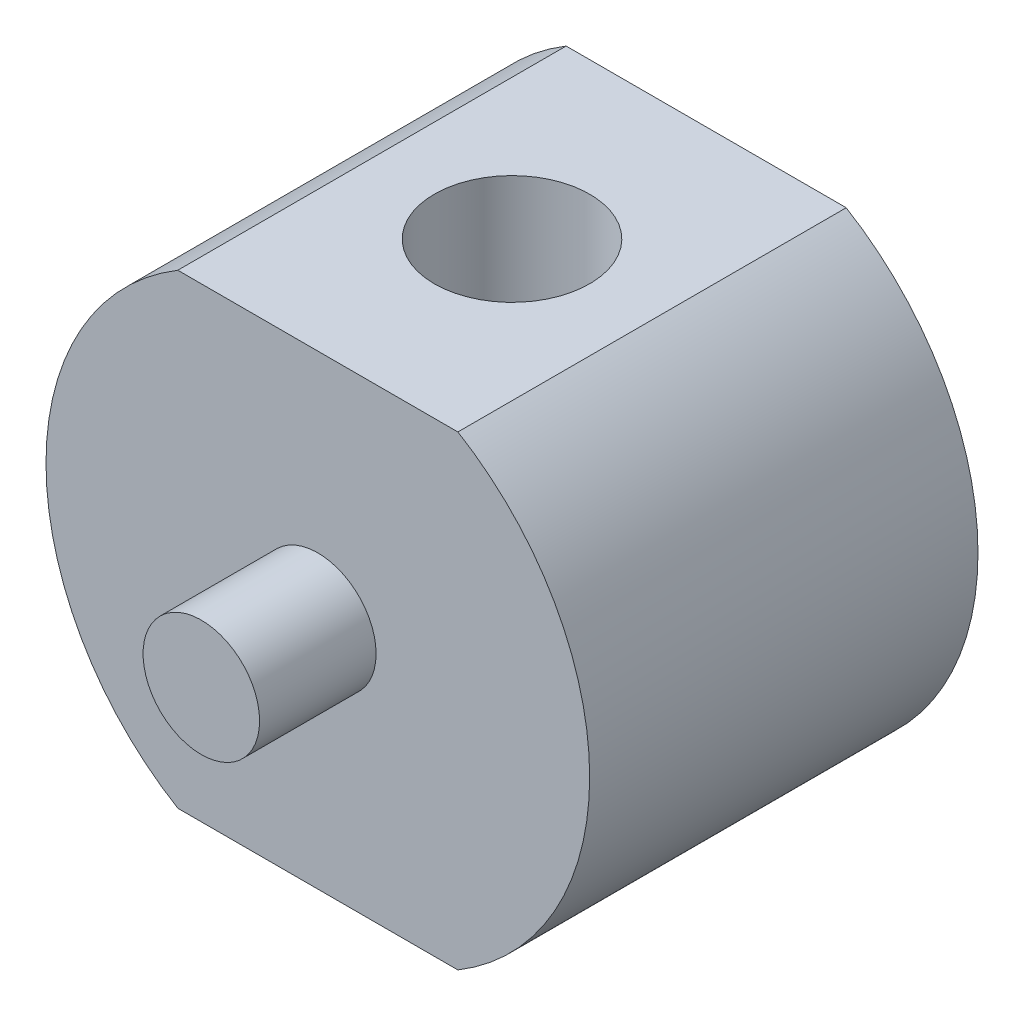
ISO-10303-21;
HEADER;
FILE_DESCRIPTION(('STEP AP214'),'2;1');
FILE_NAME('part.step','',(''),(''),'','','');
FILE_SCHEMA(('AUTOMOTIVE_DESIGN { 1 0 10303 214 1 1 1 1 }'));
ENDSEC;
DATA;
#1=APPLICATION_CONTEXT('core data for automotive mechanical design processes');
#2=APPLICATION_PROTOCOL_DEFINITION('international standard','automotive_design',2000,#1);
#3=PRODUCT_CONTEXT('',#1,'mechanical');
#4=PRODUCT('Part','Part','',(#3));
#5=PRODUCT_RELATED_PRODUCT_CATEGORY('part','',(#4));
#6=PRODUCT_DEFINITION_FORMATION('','',#4);
#7=PRODUCT_DEFINITION_CONTEXT('part definition',#1,'design');
#8=PRODUCT_DEFINITION('design','',#6,#7);
#9=PRODUCT_DEFINITION_SHAPE('','',#8);
#10=(LENGTH_UNIT() NAMED_UNIT(*) SI_UNIT(.MILLI.,.METRE.));
#11=(NAMED_UNIT(*) PLANE_ANGLE_UNIT() SI_UNIT($,.RADIAN.));
#12=(NAMED_UNIT(*) SI_UNIT($,.STERADIAN.) SOLID_ANGLE_UNIT());
#13=UNCERTAINTY_MEASURE_WITH_UNIT(LENGTH_MEASURE(1.E-05),#10,'distance_accuracy_value','');
#14=(GEOMETRIC_REPRESENTATION_CONTEXT(3) GLOBAL_UNCERTAINTY_ASSIGNED_CONTEXT((#13)) GLOBAL_UNIT_ASSIGNED_CONTEXT((#10,
#11,#12)) REPRESENTATION_CONTEXT('',''));
#15=CARTESIAN_POINT('',(0.,0.,0.));
#16=DIRECTION('',(0.,0.,1.));
#17=DIRECTION('',(1.,0.,0.));
#18=AXIS2_PLACEMENT_3D('',#15,#16,#17);
#19=CARTESIAN_POINT('',(-3.60647702767034,5.99944359494163,10.));
#20=DIRECTION('',(0.,1.,0.));
#21=DIRECTION('',(0.,0.,1.));
#22=AXIS2_PLACEMENT_3D('',#19,#20,#21);
#23=PLANE('',#22);
#24=DIRECTION('',(1.,0.,0.));
#25=VECTOR('',#24,1.);
#26=CARTESIAN_POINT('',(-3.60647702767034,5.99944359494163,10.));
#27=LINE('',#26,#25);
#28=CARTESIAN_POINT('',(-3.60647702767034,5.99944359494163,10.));
#29=VERTEX_POINT('',#28);
#30=CARTESIAN_POINT('',(3.60647702767034,5.99944359494163,10.));
#31=VERTEX_POINT('',#30);
#32=EDGE_CURVE('E105',#29,#31,#27,.T.);
#33=ORIENTED_EDGE('',*,*,#32,.T.);
#34=DIRECTION('',(0.,0.,-1.));
#35=VECTOR('',#34,1.);
#36=CARTESIAN_POINT('',(3.60647702767034,5.99944359494163,10.));
#37=LINE('',#36,#35);
#38=CARTESIAN_POINT('',(3.60647702767034,5.99944359494163,0.));
#39=VERTEX_POINT('',#38);
#40=EDGE_CURVE('E55',#31,#39,#37,.T.);
#41=ORIENTED_EDGE('',*,*,#40,.T.);
#42=DIRECTION('',(1.,0.,0.));
#43=VECTOR('',#42,1.);
#44=CARTESIAN_POINT('',(-3.60647702767034,5.99944359494163,0.));
#45=LINE('',#44,#43);
#46=CARTESIAN_POINT('',(-3.60647702767034,5.99944359494163,0.));
#47=VERTEX_POINT('',#46);
#48=EDGE_CURVE('E96',#47,#39,#45,.T.);
#49=ORIENTED_EDGE('',*,*,#48,.F.);
#50=DIRECTION('',(0.,0.,-1.));
#51=VECTOR('',#50,1.);
#52=CARTESIAN_POINT('',(-3.60647702767034,5.99944359494163,10.));
#53=LINE('',#52,#51);
#54=EDGE_CURVE('E47',#29,#47,#53,.T.);
#55=ORIENTED_EDGE('',*,*,#54,.F.);
#56=EDGE_LOOP('',(#33,#41,#49,#55));
#57=FACE_BOUND('',#56,.T.);
#58=CARTESIAN_POINT('',(0.,5.99944359494163,5.));
#59=DIRECTION('',(0.,1.,0.));
#60=DIRECTION('',(0.,0.,1.));
#61=AXIS2_PLACEMENT_3D('',#58,#59,#60);
#62=CIRCLE('',#61,2.);
#63=CARTESIAN_POINT('',(0.,5.99944359494163,7.));
#64=VERTEX_POINT('',#63);
#65=EDGE_CURVE('E116',#64,#64,#62,.T.);
#66=ORIENTED_EDGE('',*,*,#65,.F.);
#67=EDGE_LOOP('',(#66));
#68=FACE_BOUND('',#67,.T.);
#69=ADVANCED_FACE('F30',(#57,#68),#23,.T.);
#70=CARTESIAN_POINT('',(-3.60647702767034,-5.99944359494163,10.));
#71=DIRECTION('',(0.,1.,0.));
#72=DIRECTION('',(-1.,0.,0.));
#73=AXIS2_PLACEMENT_3D('',#70,#71,#72);
#74=PLANE('',#73);
#75=DIRECTION('',(0.,0.,-1.));
#76=VECTOR('',#75,1.);
#77=CARTESIAN_POINT('',(3.60647702767035,-5.99944359494162,10.));
#78=LINE('',#77,#76);
#79=CARTESIAN_POINT('',(3.60647702767035,-5.99944359494162,10.));
#80=VERTEX_POINT('',#79);
#81=CARTESIAN_POINT('',(3.60647702767035,-5.99944359494162,0.));
#82=VERTEX_POINT('',#81);
#83=EDGE_CURVE('E84',#80,#82,#78,.T.);
#84=ORIENTED_EDGE('',*,*,#83,.F.);
#85=DIRECTION('',(1.,0.,0.));
#86=VECTOR('',#85,1.);
#87=CARTESIAN_POINT('',(-3.60647702767034,-5.99944359494163,10.));
#88=LINE('',#87,#86);
#89=CARTESIAN_POINT('',(-3.60647702767034,-5.99944359494163,10.));
#90=VERTEX_POINT('',#89);
#91=EDGE_CURVE('E81',#90,#80,#88,.T.);
#92=ORIENTED_EDGE('',*,*,#91,.F.);
#93=DIRECTION('',(0.,0.,-1.));
#94=VECTOR('',#93,1.);
#95=CARTESIAN_POINT('',(-3.60647702767034,-5.99944359494163,10.));
#96=LINE('',#95,#94);
#97=CARTESIAN_POINT('',(-3.60647702767034,-5.99944359494163,0.));
#98=VERTEX_POINT('',#97);
#99=EDGE_CURVE('E34',#90,#98,#96,.T.);
#100=ORIENTED_EDGE('',*,*,#99,.T.);
#101=DIRECTION('',(1.,0.,0.));
#102=VECTOR('',#101,1.);
#103=CARTESIAN_POINT('',(-3.60647702767034,-5.99944359494163,0.));
#104=LINE('',#103,#102);
#105=EDGE_CURVE('E78',#98,#82,#104,.T.);
#106=ORIENTED_EDGE('',*,*,#105,.T.);
#107=EDGE_LOOP('',(#84,#92,#100,#106));
#108=FACE_BOUND('',#107,.T.);
#109=CARTESIAN_POINT('',(0.,-5.99944359494163,5.));
#110=DIRECTION('',(0.,1.,0.));
#111=DIRECTION('',(0.,0.,1.));
#112=AXIS2_PLACEMENT_3D('',#109,#110,#111);
#113=CIRCLE('',#112,2.);
#114=CARTESIAN_POINT('',(0.,-5.99944359494163,7.));
#115=VERTEX_POINT('',#114);
#116=EDGE_CURVE('E118',#115,#115,#113,.T.);
#117=ORIENTED_EDGE('',*,*,#116,.T.);
#118=EDGE_LOOP('',(#117));
#119=FACE_BOUND('',#118,.T.);
#120=ADVANCED_FACE('F32',(#108,#119),#74,.F.);
#121=CARTESIAN_POINT('',(0.,0.,0.));
#122=DIRECTION('',(0.,0.,1.));
#123=DIRECTION('',(1.,0.,0.));
#124=AXIS2_PLACEMENT_3D('',#121,#122,#123);
#125=PLANE('',#124);
#126=CARTESIAN_POINT('',(0.,0.,0.));
#127=DIRECTION('',(0.,0.,1.));
#128=DIRECTION('',(1.,0.,0.));
#129=AXIS2_PLACEMENT_3D('',#126,#127,#128);
#130=CIRCLE('',#129,7.);
#131=EDGE_CURVE('E86',#47,#98,#130,.T.);
#132=ORIENTED_EDGE('',*,*,#131,.F.);
#133=ORIENTED_EDGE('',*,*,#48,.T.);
#134=EDGE_CURVE('E92',#82,#39,#130,.T.);
#135=ORIENTED_EDGE('',*,*,#134,.F.);
#136=ORIENTED_EDGE('',*,*,#105,.F.);
#137=EDGE_LOOP('',(#132,#133,#135,#136));
#138=FACE_BOUND('',#137,.T.);
#139=CARTESIAN_POINT('',(0.,0.,0.));
#140=DIRECTION('',(0.,0.,-1.));
#141=DIRECTION('',(-1.,0.,0.));
#142=AXIS2_PLACEMENT_3D('',#139,#140,#141);
#143=CIRCLE('',#142,1.5);
#144=CARTESIAN_POINT('',(-1.5,0.,0.));
#145=VERTEX_POINT('',#144);
#146=EDGE_CURVE('E11',#145,#145,#143,.T.);
#147=ORIENTED_EDGE('',*,*,#146,.F.);
#148=EDGE_LOOP('',(#147));
#149=FACE_BOUND('',#148,.T.);
#150=ADVANCED_FACE('F93',(#138,#149),#125,.F.);
#151=CARTESIAN_POINT('',(0.,0.,10.));
#152=DIRECTION('',(0.,0.,-1.));
#153=DIRECTION('',(-1.,0.,0.));
#154=AXIS2_PLACEMENT_3D('',#151,#152,#153);
#155=CYLINDRICAL_SURFACE('',#154,7.);
#156=ORIENTED_EDGE('',*,*,#99,.F.);
#157=CARTESIAN_POINT('',(0.,0.,10.));
#158=DIRECTION('',(0.,0.,1.));
#159=DIRECTION('',(1.,0.,0.));
#160=AXIS2_PLACEMENT_3D('',#157,#158,#159);
#161=CIRCLE('',#160,7.);
#162=EDGE_CURVE('E101',#29,#90,#161,.T.);
#163=ORIENTED_EDGE('',*,*,#162,.F.);
#164=ORIENTED_EDGE('',*,*,#54,.T.);
#165=ORIENTED_EDGE('',*,*,#131,.T.);
#166=EDGE_LOOP('',(#156,#163,#164,#165));
#167=FACE_BOUND('',#166,.T.);
#168=ADVANCED_FACE('F87',(#167),#155,.T.);
#169=ORIENTED_EDGE('',*,*,#40,.F.);
#170=EDGE_CURVE('E103',#80,#31,#161,.T.);
#171=ORIENTED_EDGE('',*,*,#170,.F.);
#172=ORIENTED_EDGE('',*,*,#83,.T.);
#173=ORIENTED_EDGE('',*,*,#134,.T.);
#174=EDGE_LOOP('',(#169,#171,#172,#173));
#175=FACE_BOUND('',#174,.T.);
#176=ADVANCED_FACE('F108',(#175),#155,.T.);
#177=CARTESIAN_POINT('',(0.,0.,10.));
#178=DIRECTION('',(0.,0.,1.));
#179=DIRECTION('',(1.,0.,0.));
#180=AXIS2_PLACEMENT_3D('',#177,#178,#179);
#181=PLANE('',#180);
#182=CARTESIAN_POINT('',(0.,0.,10.));
#183=DIRECTION('',(0.,0.,1.));
#184=DIRECTION('',(1.,0.,0.));
#185=AXIS2_PLACEMENT_3D('',#182,#183,#184);
#186=CIRCLE('',#185,1.5);
#187=CARTESIAN_POINT('',(1.5,0.,10.));
#188=VERTEX_POINT('',#187);
#189=EDGE_CURVE('E39',#188,#188,#186,.T.);
#190=ORIENTED_EDGE('',*,*,#189,.F.);
#191=EDGE_LOOP('',(#190));
#192=FACE_BOUND('',#191,.T.);
#193=ORIENTED_EDGE('',*,*,#162,.T.);
#194=ORIENTED_EDGE('',*,*,#91,.T.);
#195=ORIENTED_EDGE('',*,*,#170,.T.);
#196=ORIENTED_EDGE('',*,*,#32,.F.);
#197=EDGE_LOOP('',(#193,#194,#195,#196));
#198=FACE_BOUND('',#197,.T.);
#199=ADVANCED_FACE('F110',(#192,#198),#181,.T.);
#200=CARTESIAN_POINT('',(0.,0.,13.));
#201=DIRECTION('',(0.,0.,-1.));
#202=DIRECTION('',(-1.,0.,0.));
#203=AXIS2_PLACEMENT_3D('',#200,#201,#202);
#204=CYLINDRICAL_SURFACE('',#203,1.5);
#205=CARTESIAN_POINT('',(0.,0.,13.));
#206=DIRECTION('',(0.,0.,1.));
#207=DIRECTION('',(1.,0.,0.));
#208=AXIS2_PLACEMENT_3D('',#205,#206,#207);
#209=CIRCLE('',#208,1.5);
#210=CARTESIAN_POINT('',(1.5,0.,13.));
#211=VERTEX_POINT('',#210);
#212=EDGE_CURVE('E90',#211,#211,#209,.T.);
#213=ORIENTED_EDGE('',*,*,#212,.F.);
#214=EDGE_LOOP('',(#213));
#215=FACE_BOUND('',#214,.T.);
#216=ORIENTED_EDGE('',*,*,#189,.T.);
#217=EDGE_LOOP('',(#216));
#218=FACE_BOUND('',#217,.T.);
#219=ADVANCED_FACE('F128',(#215,#218),#204,.T.);
#220=CARTESIAN_POINT('',(0.,0.,13.));
#221=DIRECTION('',(0.,0.,1.));
#222=DIRECTION('',(1.,0.,0.));
#223=AXIS2_PLACEMENT_3D('',#220,#221,#222);
#224=PLANE('',#223);
#225=ORIENTED_EDGE('',*,*,#212,.T.);
#226=EDGE_LOOP('',(#225));
#227=FACE_BOUND('',#226,.T.);
#228=ADVANCED_FACE('F132',(#227),#224,.T.);
#229=CARTESIAN_POINT('',(0.,0.,-3.));
#230=DIRECTION('',(0.,0.,1.));
#231=DIRECTION('',(1.,0.,0.));
#232=AXIS2_PLACEMENT_3D('',#229,#230,#231);
#233=CYLINDRICAL_SURFACE('',#232,1.5);
#234=CARTESIAN_POINT('',(0.,0.,-3.));
#235=DIRECTION('',(0.,0.,-1.));
#236=DIRECTION('',(-1.,0.,0.));
#237=AXIS2_PLACEMENT_3D('',#234,#235,#236);
#238=CIRCLE('',#237,1.5);
#239=CARTESIAN_POINT('',(-1.5,0.,-3.));
#240=VERTEX_POINT('',#239);
#241=EDGE_CURVE('E121',#240,#240,#238,.T.);
#242=ORIENTED_EDGE('',*,*,#241,.F.);
#243=EDGE_LOOP('',(#242));
#244=FACE_BOUND('',#243,.T.);
#245=ORIENTED_EDGE('',*,*,#146,.T.);
#246=EDGE_LOOP('',(#245));
#247=FACE_BOUND('',#246,.T.);
#248=ADVANCED_FACE('F143',(#244,#247),#233,.T.);
#249=CARTESIAN_POINT('',(0.,0.,-3.));
#250=DIRECTION('',(0.,0.,-1.));
#251=DIRECTION('',(-1.,0.,0.));
#252=AXIS2_PLACEMENT_3D('',#249,#250,#251);
#253=PLANE('',#252);
#254=ORIENTED_EDGE('',*,*,#241,.T.);
#255=EDGE_LOOP('',(#254));
#256=FACE_BOUND('',#255,.T.);
#257=ADVANCED_FACE('F139',(#256),#253,.T.);
#258=CARTESIAN_POINT('',(0.,5.99944359494163,5.));
#259=DIRECTION('',(0.,1.,0.));
#260=DIRECTION('',(0.,0.,1.));
#261=AXIS2_PLACEMENT_3D('',#258,#259,#260);
#262=CYLINDRICAL_SURFACE('',#261,2.);
#263=ORIENTED_EDGE('',*,*,#65,.T.);
#264=EDGE_LOOP('',(#263));
#265=FACE_BOUND('',#264,.T.);
#266=ORIENTED_EDGE('',*,*,#116,.F.);
#267=EDGE_LOOP('',(#266));
#268=FACE_BOUND('',#267,.T.);
#269=ADVANCED_FACE('F151',(#265,#268),#262,.F.);
#270=CLOSED_SHELL('',(#69,#120,#150,#168,#176,#199,#219,#228,#248,#257,#269));
#271=MANIFOLD_SOLID_BREP('B2',#270);
#272=ADVANCED_BREP_SHAPE_REPRESENTATION('',(#18,#271),#14);
#273=SHAPE_DEFINITION_REPRESENTATION(#9,#272);
ENDSEC;
END-ISO-10303-21;
